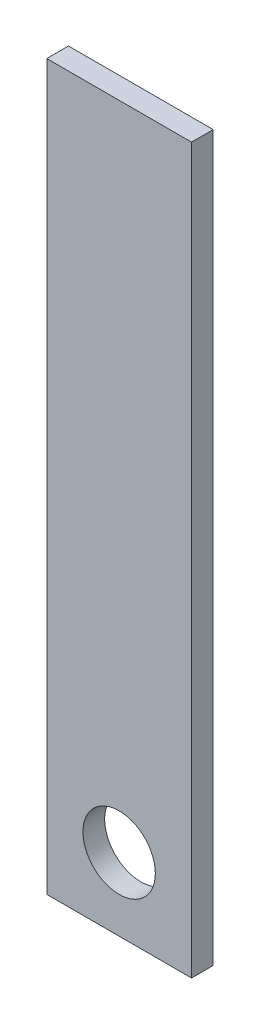
ISO-10303-21;
HEADER;
FILE_DESCRIPTION(('STEP AP214'),'2;1');
FILE_NAME('part.step','',(''),(''),'','','');
FILE_SCHEMA(('AUTOMOTIVE_DESIGN { 1 0 10303 214 1 1 1 1 }'));
ENDSEC;
DATA;
#1=APPLICATION_CONTEXT('core data for automotive mechanical design processes');
#2=APPLICATION_PROTOCOL_DEFINITION('international standard','automotive_design',2000,#1);
#3=PRODUCT_CONTEXT('',#1,'mechanical');
#4=PRODUCT('Part','Part','',(#3));
#5=PRODUCT_RELATED_PRODUCT_CATEGORY('part','',(#4));
#6=PRODUCT_DEFINITION_FORMATION('','',#4);
#7=PRODUCT_DEFINITION_CONTEXT('part definition',#1,'design');
#8=PRODUCT_DEFINITION('design','',#6,#7);
#9=PRODUCT_DEFINITION_SHAPE('','',#8);
#10=(LENGTH_UNIT() NAMED_UNIT(*) SI_UNIT(.MILLI.,.METRE.));
#11=(NAMED_UNIT(*) PLANE_ANGLE_UNIT() SI_UNIT($,.RADIAN.));
#12=(NAMED_UNIT(*) SI_UNIT($,.STERADIAN.) SOLID_ANGLE_UNIT());
#13=UNCERTAINTY_MEASURE_WITH_UNIT(LENGTH_MEASURE(1.E-05),#10,'distance_accuracy_value','');
#14=(GEOMETRIC_REPRESENTATION_CONTEXT(3) GLOBAL_UNCERTAINTY_ASSIGNED_CONTEXT((#13)) GLOBAL_UNIT_ASSIGNED_CONTEXT((#10,
#11,#12)) REPRESENTATION_CONTEXT('',''));
#15=CARTESIAN_POINT('',(0.,0.,0.));
#16=DIRECTION('',(0.,0.,1.));
#17=DIRECTION('',(1.,0.,0.));
#18=AXIS2_PLACEMENT_3D('',#15,#16,#17);
#19=CARTESIAN_POINT('',(0.,0.,3.));
#20=DIRECTION('',(1.,0.,0.));
#21=DIRECTION('',(0.,0.,-1.));
#22=AXIS2_PLACEMENT_3D('',#19,#20,#21);
#23=PLANE('',#22);
#24=DIRECTION('',(0.,-1.,0.));
#25=VECTOR('',#24,1.);
#26=CARTESIAN_POINT('',(0.,0.,0.));
#27=LINE('',#26,#25);
#28=CARTESIAN_POINT('',(0.,100.,0.));
#29=VERTEX_POINT('',#28);
#30=CARTESIAN_POINT('',(0.,0.,0.));
#31=VERTEX_POINT('',#30);
#32=EDGE_CURVE('E96',#29,#31,#27,.T.);
#33=ORIENTED_EDGE('',*,*,#32,.T.);
#34=DIRECTION('',(0.,0.,-1.));
#35=VECTOR('',#34,1.);
#36=CARTESIAN_POINT('',(0.,0.,3.));
#37=LINE('',#36,#35);
#38=CARTESIAN_POINT('',(0.,0.,3.));
#39=VERTEX_POINT('',#38);
#40=EDGE_CURVE('E11',#39,#31,#37,.T.);
#41=ORIENTED_EDGE('',*,*,#40,.F.);
#42=DIRECTION('',(0.,-1.,0.));
#43=VECTOR('',#42,1.);
#44=CARTESIAN_POINT('',(0.,0.,3.));
#45=LINE('',#44,#43);
#46=CARTESIAN_POINT('',(0.,100.,3.));
#47=VERTEX_POINT('',#46);
#48=EDGE_CURVE('E84',#47,#39,#45,.T.);
#49=ORIENTED_EDGE('',*,*,#48,.F.);
#50=DIRECTION('',(0.,0.,-1.));
#51=VECTOR('',#50,1.);
#52=CARTESIAN_POINT('',(0.,100.,3.));
#53=LINE('',#52,#51);
#54=EDGE_CURVE('E92',#47,#29,#53,.T.);
#55=ORIENTED_EDGE('',*,*,#54,.T.);
#56=EDGE_LOOP('',(#33,#41,#49,#55));
#57=FACE_BOUND('',#56,.T.);
#58=ADVANCED_FACE('F33',(#57),#23,.F.);
#59=CARTESIAN_POINT('',(0.,0.,3.));
#60=DIRECTION('',(0.,1.,0.));
#61=DIRECTION('',(0.,0.,1.));
#62=AXIS2_PLACEMENT_3D('',#59,#60,#61);
#63=PLANE('',#62);
#64=DIRECTION('',(1.,0.,0.));
#65=VECTOR('',#64,1.);
#66=CARTESIAN_POINT('',(0.,0.,0.));
#67=LINE('',#66,#65);
#68=CARTESIAN_POINT('',(20.,0.,0.));
#69=VERTEX_POINT('',#68);
#70=EDGE_CURVE('E88',#31,#69,#67,.T.);
#71=ORIENTED_EDGE('',*,*,#70,.T.);
#72=DIRECTION('',(0.,0.,-1.));
#73=VECTOR('',#72,1.);
#74=CARTESIAN_POINT('',(20.,0.,3.));
#75=LINE('',#74,#73);
#76=CARTESIAN_POINT('',(20.,0.,3.));
#77=VERTEX_POINT('',#76);
#78=EDGE_CURVE('E41',#77,#69,#75,.T.);
#79=ORIENTED_EDGE('',*,*,#78,.F.);
#80=DIRECTION('',(1.,0.,0.));
#81=VECTOR('',#80,1.);
#82=CARTESIAN_POINT('',(0.,0.,3.));
#83=LINE('',#82,#81);
#84=EDGE_CURVE('E79',#39,#77,#83,.T.);
#85=ORIENTED_EDGE('',*,*,#84,.F.);
#86=ORIENTED_EDGE('',*,*,#40,.T.);
#87=EDGE_LOOP('',(#71,#79,#85,#86));
#88=FACE_BOUND('',#87,.T.);
#89=ADVANCED_FACE('F87',(#88),#63,.F.);
#90=CARTESIAN_POINT('',(20.,0.,3.));
#91=DIRECTION('',(-1.,0.,0.));
#92=DIRECTION('',(0.,0.,1.));
#93=AXIS2_PLACEMENT_3D('',#90,#91,#92);
#94=PLANE('',#93);
#95=DIRECTION('',(0.,1.,0.));
#96=VECTOR('',#95,1.);
#97=CARTESIAN_POINT('',(20.,0.,0.));
#98=LINE('',#97,#96);
#99=CARTESIAN_POINT('',(20.,100.,0.));
#100=VERTEX_POINT('',#99);
#101=EDGE_CURVE('E66',#69,#100,#98,.T.);
#102=ORIENTED_EDGE('',*,*,#101,.T.);
#103=DIRECTION('',(0.,0.,-1.));
#104=VECTOR('',#103,1.);
#105=CARTESIAN_POINT('',(20.,100.,3.));
#106=LINE('',#105,#104);
#107=CARTESIAN_POINT('',(20.,100.,3.));
#108=VERTEX_POINT('',#107);
#109=EDGE_CURVE('E89',#108,#100,#106,.T.);
#110=ORIENTED_EDGE('',*,*,#109,.F.);
#111=DIRECTION('',(0.,1.,0.));
#112=VECTOR('',#111,1.);
#113=CARTESIAN_POINT('',(20.,0.,3.));
#114=LINE('',#113,#112);
#115=EDGE_CURVE('E82',#77,#108,#114,.T.);
#116=ORIENTED_EDGE('',*,*,#115,.F.);
#117=ORIENTED_EDGE('',*,*,#78,.T.);
#118=EDGE_LOOP('',(#102,#110,#116,#117));
#119=FACE_BOUND('',#118,.T.);
#120=ADVANCED_FACE('F90',(#119),#94,.F.);
#121=CARTESIAN_POINT('',(0.,100.,3.));
#122=DIRECTION('',(0.,-1.,0.));
#123=DIRECTION('',(0.,0.,-1.));
#124=AXIS2_PLACEMENT_3D('',#121,#122,#123);
#125=PLANE('',#124);
#126=DIRECTION('',(-1.,0.,0.));
#127=VECTOR('',#126,1.);
#128=CARTESIAN_POINT('',(0.,100.,0.));
#129=LINE('',#128,#127);
#130=EDGE_CURVE('E72',#100,#29,#129,.T.);
#131=ORIENTED_EDGE('',*,*,#130,.T.);
#132=ORIENTED_EDGE('',*,*,#54,.F.);
#133=DIRECTION('',(-1.,0.,0.));
#134=VECTOR('',#133,1.);
#135=CARTESIAN_POINT('',(0.,100.,3.));
#136=LINE('',#135,#134);
#137=EDGE_CURVE('E49',#108,#47,#136,.T.);
#138=ORIENTED_EDGE('',*,*,#137,.F.);
#139=ORIENTED_EDGE('',*,*,#109,.T.);
#140=EDGE_LOOP('',(#131,#132,#138,#139));
#141=FACE_BOUND('',#140,.T.);
#142=ADVANCED_FACE('F104',(#141),#125,.F.);
#143=CARTESIAN_POINT('',(0.,0.,3.));
#144=DIRECTION('',(0.,0.,-1.));
#145=DIRECTION('',(-1.,0.,0.));
#146=AXIS2_PLACEMENT_3D('',#143,#144,#145);
#147=PLANE('',#146);
#148=CARTESIAN_POINT('',(10.,10.,3.));
#149=DIRECTION('',(0.,0.,1.));
#150=DIRECTION('',(1.,0.,0.));
#151=AXIS2_PLACEMENT_3D('',#148,#149,#150);
#152=CIRCLE('',#151,5.);
#153=CARTESIAN_POINT('',(15.,10.,3.));
#154=VERTEX_POINT('',#153);
#155=EDGE_CURVE('E110',#154,#154,#152,.T.);
#156=ORIENTED_EDGE('',*,*,#155,.F.);
#157=EDGE_LOOP('',(#156));
#158=FACE_BOUND('',#157,.T.);
#159=ORIENTED_EDGE('',*,*,#48,.T.);
#160=ORIENTED_EDGE('',*,*,#84,.T.);
#161=ORIENTED_EDGE('',*,*,#115,.T.);
#162=ORIENTED_EDGE('',*,*,#137,.T.);
#163=EDGE_LOOP('',(#159,#160,#161,#162));
#164=FACE_BOUND('',#163,.T.);
#165=ADVANCED_FACE('F80',(#158,#164),#147,.F.);
#166=CARTESIAN_POINT('',(0.,0.,0.));
#167=DIRECTION('',(0.,0.,-1.));
#168=DIRECTION('',(-1.,0.,0.));
#169=AXIS2_PLACEMENT_3D('',#166,#167,#168);
#170=PLANE('',#169);
#171=CARTESIAN_POINT('',(10.,10.,0.));
#172=DIRECTION('',(0.,0.,1.));
#173=DIRECTION('',(1.,0.,0.));
#174=AXIS2_PLACEMENT_3D('',#171,#172,#173);
#175=CIRCLE('',#174,5.);
#176=CARTESIAN_POINT('',(15.,10.,0.));
#177=VERTEX_POINT('',#176);
#178=EDGE_CURVE('E99',#177,#177,#175,.T.);
#179=ORIENTED_EDGE('',*,*,#178,.T.);
#180=EDGE_LOOP('',(#179));
#181=FACE_BOUND('',#180,.T.);
#182=ORIENTED_EDGE('',*,*,#32,.F.);
#183=ORIENTED_EDGE('',*,*,#130,.F.);
#184=ORIENTED_EDGE('',*,*,#101,.F.);
#185=ORIENTED_EDGE('',*,*,#70,.F.);
#186=EDGE_LOOP('',(#182,#183,#184,#185));
#187=FACE_BOUND('',#186,.T.);
#188=ADVANCED_FACE('F107',(#181,#187),#170,.T.);
#189=CARTESIAN_POINT('',(10.,10.,0.));
#190=DIRECTION('',(0.,0.,1.));
#191=DIRECTION('',(1.,0.,0.));
#192=AXIS2_PLACEMENT_3D('',#189,#190,#191);
#193=CYLINDRICAL_SURFACE('',#192,5.);
#194=ORIENTED_EDGE('',*,*,#178,.F.);
#195=EDGE_LOOP('',(#194));
#196=FACE_BOUND('',#195,.T.);
#197=ORIENTED_EDGE('',*,*,#155,.T.);
#198=EDGE_LOOP('',(#197));
#199=FACE_BOUND('',#198,.T.);
#200=ADVANCED_FACE('F117',(#196,#199),#193,.F.);
#201=CLOSED_SHELL('',(#58,#89,#120,#142,#165,#188,#200));
#202=MANIFOLD_SOLID_BREP('B2',#201);
#203=ADVANCED_BREP_SHAPE_REPRESENTATION('',(#18,#202),#14);
#204=SHAPE_DEFINITION_REPRESENTATION(#9,#203);
ENDSEC;
END-ISO-10303-21;
